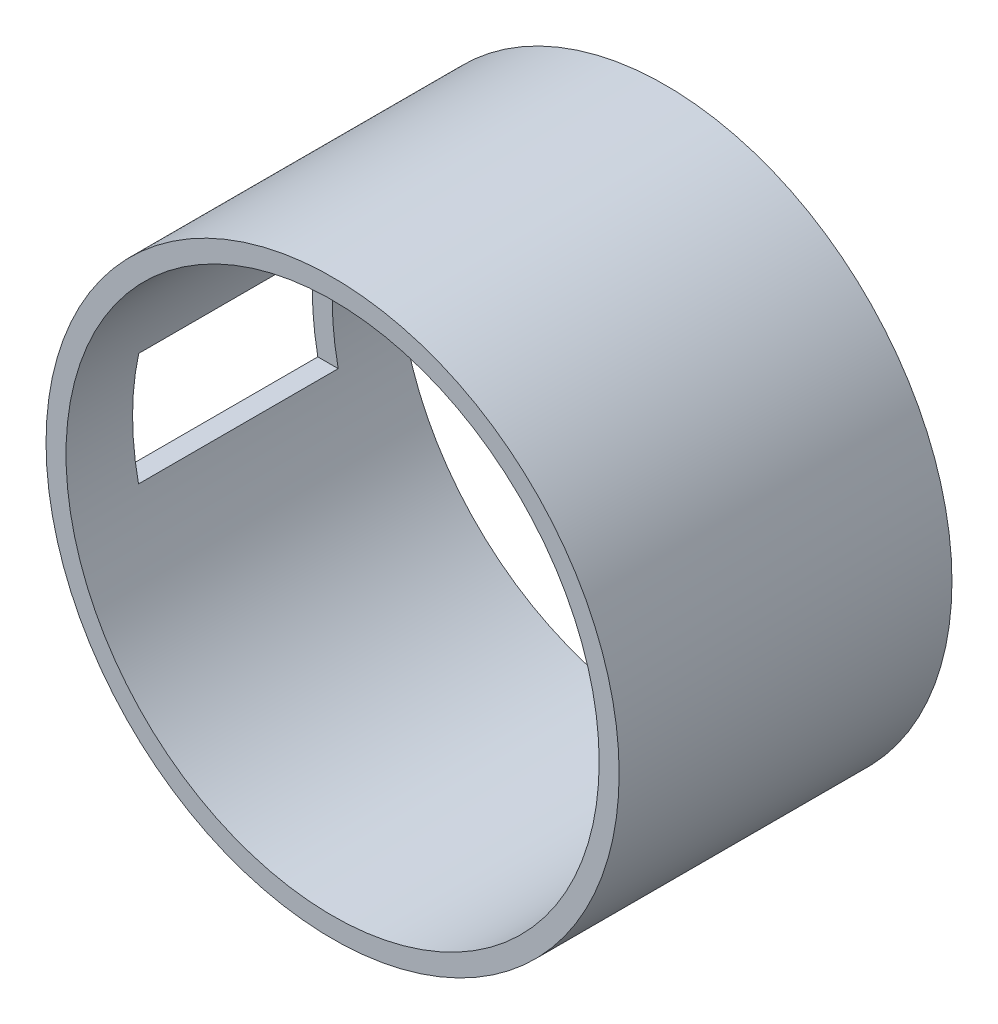
ISO-10303-21;
HEADER;
FILE_DESCRIPTION(('STEP AP214'),'2;1');
FILE_NAME('part.step','',(''),(''),'','','');
FILE_SCHEMA(('AUTOMOTIVE_DESIGN { 1 0 10303 214 1 1 1 1 }'));
ENDSEC;
DATA;
#1=APPLICATION_CONTEXT('core data for automotive mechanical design processes');
#2=APPLICATION_PROTOCOL_DEFINITION('international standard','automotive_design',2000,#1);
#3=PRODUCT_CONTEXT('',#1,'mechanical');
#4=PRODUCT('Part','Part','',(#3));
#5=PRODUCT_RELATED_PRODUCT_CATEGORY('part','',(#4));
#6=PRODUCT_DEFINITION_FORMATION('','',#4);
#7=PRODUCT_DEFINITION_CONTEXT('part definition',#1,'design');
#8=PRODUCT_DEFINITION('design','',#6,#7);
#9=PRODUCT_DEFINITION_SHAPE('','',#8);
#10=(LENGTH_UNIT() NAMED_UNIT(*) SI_UNIT(.MILLI.,.METRE.));
#11=(NAMED_UNIT(*) PLANE_ANGLE_UNIT() SI_UNIT($,.RADIAN.));
#12=(NAMED_UNIT(*) SI_UNIT($,.STERADIAN.) SOLID_ANGLE_UNIT());
#13=UNCERTAINTY_MEASURE_WITH_UNIT(LENGTH_MEASURE(1.E-05),#10,'distance_accuracy_value','');
#14=(GEOMETRIC_REPRESENTATION_CONTEXT(3) GLOBAL_UNCERTAINTY_ASSIGNED_CONTEXT((#13)) GLOBAL_UNIT_ASSIGNED_CONTEXT((#10,
#11,#12)) REPRESENTATION_CONTEXT('',''));
#15=CARTESIAN_POINT('',(0.,0.,0.));
#16=DIRECTION('',(0.,0.,1.));
#17=DIRECTION('',(1.,0.,0.));
#18=AXIS2_PLACEMENT_3D('',#15,#16,#17);
#19=CARTESIAN_POINT('',(0.,0.,10.));
#20=DIRECTION('',(0.,0.,1.));
#21=DIRECTION('',(1.,0.,0.));
#22=AXIS2_PLACEMENT_3D('',#19,#20,#21);
#23=PLANE('',#22);
#24=CARTESIAN_POINT('',(0.,0.,10.));
#25=DIRECTION('',(0.,0.,1.));
#26=DIRECTION('',(1.,0.,0.));
#27=AXIS2_PLACEMENT_3D('',#24,#25,#26);
#28=CIRCLE('',#27,8.61);
#29=CARTESIAN_POINT('',(8.61,0.,10.));
#30=VERTEX_POINT('',#29);
#31=EDGE_CURVE('E91',#30,#30,#28,.T.);
#32=ORIENTED_EDGE('',*,*,#31,.T.);
#33=EDGE_LOOP('',(#32));
#34=FACE_BOUND('',#33,.T.);
#35=CARTESIAN_POINT('',(0.,0.,10.));
#36=DIRECTION('',(0.,0.,1.));
#37=DIRECTION('',(1.,0.,0.));
#38=AXIS2_PLACEMENT_3D('',#35,#36,#37);
#39=CIRCLE('',#38,8.01);
#40=CARTESIAN_POINT('',(8.01,0.,10.));
#41=VERTEX_POINT('',#40);
#42=EDGE_CURVE('E115',#41,#41,#39,.T.);
#43=ORIENTED_EDGE('',*,*,#42,.F.);
#44=EDGE_LOOP('',(#43));
#45=FACE_BOUND('',#44,.T.);
#46=ADVANCED_FACE('F45',(#34,#45),#23,.T.);
#47=CARTESIAN_POINT('',(0.,0.,0.));
#48=DIRECTION('',(0.,0.,1.));
#49=DIRECTION('',(1.,0.,0.));
#50=AXIS2_PLACEMENT_3D('',#47,#48,#49);
#51=PLANE('',#50);
#52=CARTESIAN_POINT('',(0.,0.,0.));
#53=DIRECTION('',(0.,0.,1.));
#54=DIRECTION('',(1.,0.,0.));
#55=AXIS2_PLACEMENT_3D('',#52,#53,#54);
#56=CIRCLE('',#55,8.61);
#57=CARTESIAN_POINT('',(8.61,0.,0.));
#58=VERTEX_POINT('',#57);
#59=EDGE_CURVE('E111',#58,#58,#56,.T.);
#60=ORIENTED_EDGE('',*,*,#59,.F.);
#61=EDGE_LOOP('',(#60));
#62=FACE_BOUND('',#61,.T.);
#63=CARTESIAN_POINT('',(0.,0.,0.));
#64=DIRECTION('',(0.,0.,1.));
#65=DIRECTION('',(1.,0.,0.));
#66=AXIS2_PLACEMENT_3D('',#63,#64,#65);
#67=CIRCLE('',#66,8.01);
#68=CARTESIAN_POINT('',(8.01,0.,0.));
#69=VERTEX_POINT('',#68);
#70=EDGE_CURVE('E119',#69,#69,#67,.T.);
#71=ORIENTED_EDGE('',*,*,#70,.T.);
#72=EDGE_LOOP('',(#71));
#73=FACE_BOUND('',#72,.T.);
#74=ADVANCED_FACE('F160',(#62,#73),#51,.F.);
#75=CARTESIAN_POINT('',(0.,0.,10.));
#76=DIRECTION('',(0.,0.,-1.));
#77=DIRECTION('',(-1.,0.,0.));
#78=AXIS2_PLACEMENT_3D('',#75,#76,#77);
#79=CYLINDRICAL_SURFACE('',#78,8.61);
#80=DIRECTION('',(0.,0.,-1.));
#81=VECTOR('',#80,1.);
#82=CARTESIAN_POINT('',(-8.43750070836645,1.71484162426612,10.));
#83=LINE('',#82,#81);
#84=CARTESIAN_POINT('',(-8.43750070836645,1.71484162426612,2.));
#85=VERTEX_POINT('',#84);
#86=CARTESIAN_POINT('',(-8.43750070836645,1.71484162426612,8.));
#87=VERTEX_POINT('',#86);
#88=EDGE_CURVE('E128',#85,#87,#83,.F.);
#89=ORIENTED_EDGE('',*,*,#88,.T.);
#90=CARTESIAN_POINT('',(0.,0.,8.));
#91=DIRECTION('',(0.,0.,1.));
#92=DIRECTION('',(1.,0.,0.));
#93=AXIS2_PLACEMENT_3D('',#90,#91,#92);
#94=CIRCLE('',#93,8.61);
#95=CARTESIAN_POINT('',(-8.44347921467768,-1.68515837573388,8.));
#96=VERTEX_POINT('',#95);
#97=EDGE_CURVE('E132',#87,#96,#94,.T.);
#98=ORIENTED_EDGE('',*,*,#97,.T.);
#99=DIRECTION('',(0.,0.,-1.));
#100=VECTOR('',#99,1.);
#101=CARTESIAN_POINT('',(-8.44347921467768,-1.68515837573388,10.));
#102=LINE('',#101,#100);
#103=CARTESIAN_POINT('',(-8.44347921467768,-1.68515837573388,2.));
#104=VERTEX_POINT('',#103);
#105=EDGE_CURVE('E135',#96,#104,#102,.T.);
#106=ORIENTED_EDGE('',*,*,#105,.T.);
#107=CARTESIAN_POINT('',(0.,0.,2.));
#108=DIRECTION('',(0.,0.,-1.));
#109=DIRECTION('',(0.,1.,0.));
#110=AXIS2_PLACEMENT_3D('',#107,#108,#109);
#111=CIRCLE('',#110,8.61);
#112=EDGE_CURVE('E97',#104,#85,#111,.T.);
#113=ORIENTED_EDGE('',*,*,#112,.T.);
#114=EDGE_LOOP('',(#89,#98,#106,#113));
#115=FACE_BOUND('',#114,.T.);
#116=ORIENTED_EDGE('',*,*,#31,.F.);
#117=EDGE_LOOP('',(#116));
#118=FACE_BOUND('',#117,.T.);
#119=ORIENTED_EDGE('',*,*,#59,.T.);
#120=EDGE_LOOP('',(#119));
#121=FACE_BOUND('',#120,.T.);
#122=ADVANCED_FACE('F47',(#115,#118,#121),#79,.T.);
#123=CARTESIAN_POINT('',(0.,0.,10.));
#124=DIRECTION('',(0.,0.,-1.));
#125=DIRECTION('',(-1.,0.,0.));
#126=AXIS2_PLACEMENT_3D('',#123,#124,#125);
#127=CYLINDRICAL_SURFACE('',#126,8.01);
#128=CARTESIAN_POINT('',(0.,0.,2.));
#129=DIRECTION('',(0.,0.,-1.));
#130=DIRECTION('',(0.,1.,0.));
#131=AXIS2_PLACEMENT_3D('',#128,#129,#130);
#132=CIRCLE('',#131,8.01);
#133=CARTESIAN_POINT('',(-7.83073056928241,-1.68515837573388,2.));
#134=VERTEX_POINT('',#133);
#135=CARTESIAN_POINT('',(-7.82428387800982,1.71484162426612,2.));
#136=VERTEX_POINT('',#135);
#137=EDGE_CURVE('E11',#134,#136,#132,.T.);
#138=ORIENTED_EDGE('',*,*,#137,.F.);
#139=DIRECTION('',(0.,0.,-1.));
#140=VECTOR('',#139,1.);
#141=CARTESIAN_POINT('',(-7.83073056928241,-1.68515837573388,10.));
#142=LINE('',#141,#140);
#143=CARTESIAN_POINT('',(-7.83073056928241,-1.68515837573388,8.));
#144=VERTEX_POINT('',#143);
#145=EDGE_CURVE('E84',#144,#134,#142,.T.);
#146=ORIENTED_EDGE('',*,*,#145,.F.);
#147=CARTESIAN_POINT('',(0.,0.,8.));
#148=DIRECTION('',(0.,0.,1.));
#149=DIRECTION('',(1.,0.,0.));
#150=AXIS2_PLACEMENT_3D('',#147,#148,#149);
#151=CIRCLE('',#150,8.01);
#152=CARTESIAN_POINT('',(-7.82428387800982,1.71484162426612,8.));
#153=VERTEX_POINT('',#152);
#154=EDGE_CURVE('E90',#153,#144,#151,.T.);
#155=ORIENTED_EDGE('',*,*,#154,.F.);
#156=DIRECTION('',(0.,0.,-1.));
#157=VECTOR('',#156,1.);
#158=CARTESIAN_POINT('',(-7.82428387800982,1.71484162426612,10.));
#159=LINE('',#158,#157);
#160=EDGE_CURVE('E54',#136,#153,#159,.F.);
#161=ORIENTED_EDGE('',*,*,#160,.F.);
#162=EDGE_LOOP('',(#138,#146,#155,#161));
#163=FACE_BOUND('',#162,.T.);
#164=ORIENTED_EDGE('',*,*,#42,.T.);
#165=EDGE_LOOP('',(#164));
#166=FACE_BOUND('',#165,.T.);
#167=ORIENTED_EDGE('',*,*,#70,.F.);
#168=EDGE_LOOP('',(#167));
#169=FACE_BOUND('',#168,.T.);
#170=ADVANCED_FACE('F102',(#163,#166,#169),#127,.F.);
#171=CARTESIAN_POINT('',(-7.11,1.71484162426612,2.));
#172=DIRECTION('',(0.,0.,-1.));
#173=DIRECTION('',(0.,1.,0.));
#174=AXIS2_PLACEMENT_3D('',#171,#172,#173);
#175=PLANE('',#174);
#176=DIRECTION('',(-1.,0.,0.));
#177=VECTOR('',#176,1.);
#178=CARTESIAN_POINT('',(-7.11,-1.68515837573388,2.));
#179=LINE('',#178,#177);
#180=EDGE_CURVE('E61',#134,#104,#179,.T.);
#181=ORIENTED_EDGE('',*,*,#180,.F.);
#182=ORIENTED_EDGE('',*,*,#137,.T.);
#183=DIRECTION('',(-1.,0.,0.));
#184=VECTOR('',#183,1.);
#185=CARTESIAN_POINT('',(-7.11,1.71484162426612,2.));
#186=LINE('',#185,#184);
#187=EDGE_CURVE('E137',#136,#85,#186,.T.);
#188=ORIENTED_EDGE('',*,*,#187,.T.);
#189=ORIENTED_EDGE('',*,*,#112,.F.);
#190=EDGE_LOOP('',(#181,#182,#188,#189));
#191=FACE_BOUND('',#190,.T.);
#192=ADVANCED_FACE('F94',(#191),#175,.F.);
#193=CARTESIAN_POINT('',(-7.11,1.71484162426612,2.));
#194=DIRECTION('',(0.,1.,0.));
#195=DIRECTION('',(0.,0.,1.));
#196=AXIS2_PLACEMENT_3D('',#193,#194,#195);
#197=PLANE('',#196);
#198=ORIENTED_EDGE('',*,*,#187,.F.);
#199=ORIENTED_EDGE('',*,*,#160,.T.);
#200=DIRECTION('',(-1.,0.,0.));
#201=VECTOR('',#200,1.);
#202=CARTESIAN_POINT('',(-7.11,1.71484162426612,8.));
#203=LINE('',#202,#201);
#204=EDGE_CURVE('E141',#153,#87,#203,.T.);
#205=ORIENTED_EDGE('',*,*,#204,.T.);
#206=ORIENTED_EDGE('',*,*,#88,.F.);
#207=EDGE_LOOP('',(#198,#199,#205,#206));
#208=FACE_BOUND('',#207,.T.);
#209=ADVANCED_FACE('F146',(#208),#197,.F.);
#210=CARTESIAN_POINT('',(-7.11,1.71484162426612,8.));
#211=DIRECTION('',(0.,0.,1.));
#212=DIRECTION('',(1.,0.,0.));
#213=AXIS2_PLACEMENT_3D('',#210,#211,#212);
#214=PLANE('',#213);
#215=ORIENTED_EDGE('',*,*,#204,.F.);
#216=ORIENTED_EDGE('',*,*,#154,.T.);
#217=DIRECTION('',(-1.,0.,0.));
#218=VECTOR('',#217,1.);
#219=CARTESIAN_POINT('',(-7.11,-1.68515837573388,8.));
#220=LINE('',#219,#218);
#221=EDGE_CURVE('E66',#144,#96,#220,.T.);
#222=ORIENTED_EDGE('',*,*,#221,.T.);
#223=ORIENTED_EDGE('',*,*,#97,.F.);
#224=EDGE_LOOP('',(#215,#216,#222,#223));
#225=FACE_BOUND('',#224,.T.);
#226=ADVANCED_FACE('F150',(#225),#214,.F.);
#227=CARTESIAN_POINT('',(-7.11,-1.68515837573388,2.));
#228=DIRECTION('',(0.,-1.,0.));
#229=DIRECTION('',(0.,0.,-1.));
#230=AXIS2_PLACEMENT_3D('',#227,#228,#229);
#231=PLANE('',#230);
#232=ORIENTED_EDGE('',*,*,#221,.F.);
#233=ORIENTED_EDGE('',*,*,#145,.T.);
#234=ORIENTED_EDGE('',*,*,#180,.T.);
#235=ORIENTED_EDGE('',*,*,#105,.F.);
#236=EDGE_LOOP('',(#232,#233,#234,#235));
#237=FACE_BOUND('',#236,.T.);
#238=ADVANCED_FACE('F85',(#237),#231,.F.);
#239=CLOSED_SHELL('',(#46,#74,#122,#170,#192,#209,#226,#238));
#240=MANIFOLD_SOLID_BREP('B2',#239);
#241=ADVANCED_BREP_SHAPE_REPRESENTATION('',(#18,#240),#14);
#242=SHAPE_DEFINITION_REPRESENTATION(#9,#241);
ENDSEC;
END-ISO-10303-21;
